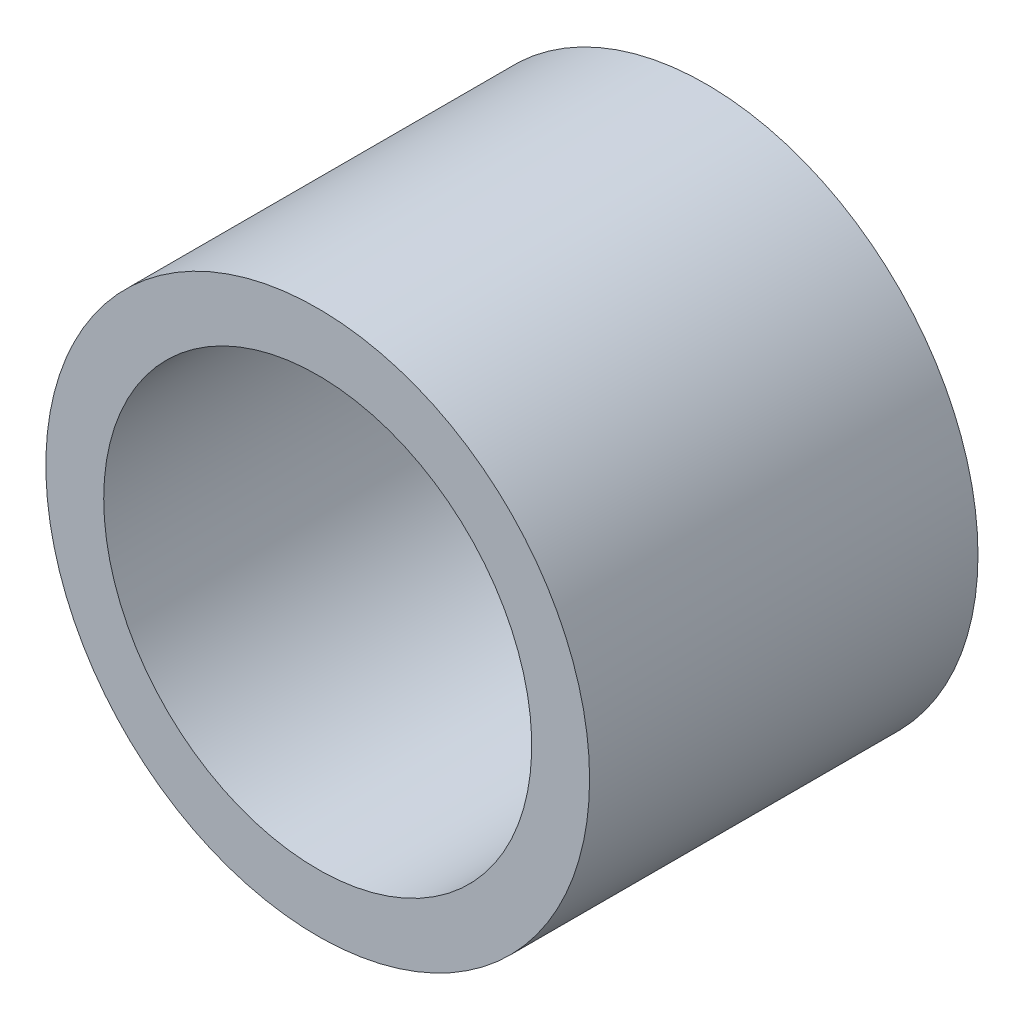
ISO-10303-21;
HEADER;
FILE_DESCRIPTION(('STEP AP214'),'2;1');
FILE_NAME('part.step','',(''),(''),'','','');
FILE_SCHEMA(('AUTOMOTIVE_DESIGN { 1 0 10303 214 1 1 1 1 }'));
ENDSEC;
DATA;
#1=APPLICATION_CONTEXT('core data for automotive mechanical design processes');
#2=APPLICATION_PROTOCOL_DEFINITION('international standard','automotive_design',2000,#1);
#3=PRODUCT_CONTEXT('',#1,'mechanical');
#4=PRODUCT('Part','Part','',(#3));
#5=PRODUCT_RELATED_PRODUCT_CATEGORY('part','',(#4));
#6=PRODUCT_DEFINITION_FORMATION('','',#4);
#7=PRODUCT_DEFINITION_CONTEXT('part definition',#1,'design');
#8=PRODUCT_DEFINITION('design','',#6,#7);
#9=PRODUCT_DEFINITION_SHAPE('','',#8);
#10=(LENGTH_UNIT() NAMED_UNIT(*) SI_UNIT(.MILLI.,.METRE.));
#11=(NAMED_UNIT(*) PLANE_ANGLE_UNIT() SI_UNIT($,.RADIAN.));
#12=(NAMED_UNIT(*) SI_UNIT($,.STERADIAN.) SOLID_ANGLE_UNIT());
#13=UNCERTAINTY_MEASURE_WITH_UNIT(LENGTH_MEASURE(1.E-05),#10,'distance_accuracy_value','');
#14=(GEOMETRIC_REPRESENTATION_CONTEXT(3) GLOBAL_UNCERTAINTY_ASSIGNED_CONTEXT((#13)) GLOBAL_UNIT_ASSIGNED_CONTEXT((#10,
#11,#12)) REPRESENTATION_CONTEXT('',''));
#15=CARTESIAN_POINT('',(0.,0.,0.));
#16=DIRECTION('',(0.,0.,1.));
#17=DIRECTION('',(1.,0.,0.));
#18=AXIS2_PLACEMENT_3D('',#15,#16,#17);
#19=CARTESIAN_POINT('',(0.,0.,20.));
#20=DIRECTION('',(0.,0.,-1.));
#21=DIRECTION('',(-1.,0.,0.));
#22=AXIS2_PLACEMENT_3D('',#19,#20,#21);
#23=CYLINDRICAL_SURFACE('',#22,14.);
#24=CARTESIAN_POINT('',(0.,0.,20.));
#25=DIRECTION('',(0.,0.,1.));
#26=DIRECTION('',(1.,0.,0.));
#27=AXIS2_PLACEMENT_3D('',#24,#25,#26);
#28=CIRCLE('',#27,14.);
#29=CARTESIAN_POINT('',(14.,0.,20.));
#30=VERTEX_POINT('',#29);
#31=EDGE_CURVE('E10',#30,#30,#28,.T.);
#32=ORIENTED_EDGE('',*,*,#31,.F.);
#33=EDGE_LOOP('',(#32));
#34=FACE_BOUND('',#33,.T.);
#35=CARTESIAN_POINT('',(0.,0.,0.));
#36=DIRECTION('',(0.,0.,1.));
#37=DIRECTION('',(1.,0.,0.));
#38=AXIS2_PLACEMENT_3D('',#35,#36,#37);
#39=CIRCLE('',#38,14.);
#40=CARTESIAN_POINT('',(14.,0.,0.));
#41=VERTEX_POINT('',#40);
#42=EDGE_CURVE('E42',#41,#41,#39,.T.);
#43=ORIENTED_EDGE('',*,*,#42,.T.);
#44=EDGE_LOOP('',(#43));
#45=FACE_BOUND('',#44,.T.);
#46=ADVANCED_FACE('F39',(#34,#45),#23,.T.);
#47=CARTESIAN_POINT('',(0.,0.,20.));
#48=DIRECTION('',(0.,0.,1.));
#49=DIRECTION('',(1.,0.,0.));
#50=AXIS2_PLACEMENT_3D('',#47,#48,#49);
#51=PLANE('',#50);
#52=CARTESIAN_POINT('',(0.,0.,20.));
#53=DIRECTION('',(0.,0.,-1.));
#54=DIRECTION('',(-1.,0.,0.));
#55=AXIS2_PLACEMENT_3D('',#52,#53,#54);
#56=CIRCLE('',#55,11.02);
#57=CARTESIAN_POINT('',(-11.02,0.,20.));
#58=VERTEX_POINT('',#57);
#59=EDGE_CURVE('E49',#58,#58,#56,.T.);
#60=ORIENTED_EDGE('',*,*,#59,.T.);
#61=EDGE_LOOP('',(#60));
#62=FACE_BOUND('',#61,.T.);
#63=ORIENTED_EDGE('',*,*,#31,.T.);
#64=EDGE_LOOP('',(#63));
#65=FACE_BOUND('',#64,.T.);
#66=ADVANCED_FACE('F57',(#62,#65),#51,.T.);
#67=CARTESIAN_POINT('',(0.,0.,0.));
#68=DIRECTION('',(0.,0.,1.));
#69=DIRECTION('',(1.,0.,0.));
#70=AXIS2_PLACEMENT_3D('',#67,#68,#69);
#71=PLANE('',#70);
#72=CARTESIAN_POINT('',(0.,0.,0.));
#73=DIRECTION('',(0.,0.,-1.));
#74=DIRECTION('',(-1.,0.,0.));
#75=AXIS2_PLACEMENT_3D('',#72,#73,#74);
#76=CIRCLE('',#75,11.02);
#77=CARTESIAN_POINT('',(-11.02,0.,0.));
#78=VERTEX_POINT('',#77);
#79=EDGE_CURVE('E51',#78,#78,#76,.T.);
#80=ORIENTED_EDGE('',*,*,#79,.F.);
#81=EDGE_LOOP('',(#80));
#82=FACE_BOUND('',#81,.T.);
#83=ORIENTED_EDGE('',*,*,#42,.F.);
#84=EDGE_LOOP('',(#83));
#85=FACE_BOUND('',#84,.T.);
#86=ADVANCED_FACE('F62',(#82,#85),#71,.F.);
#87=CARTESIAN_POINT('',(0.,0.,20.));
#88=DIRECTION('',(0.,0.,-1.));
#89=DIRECTION('',(-1.,0.,0.));
#90=AXIS2_PLACEMENT_3D('',#87,#88,#89);
#91=CYLINDRICAL_SURFACE('',#90,11.02);
#92=ORIENTED_EDGE('',*,*,#59,.F.);
#93=EDGE_LOOP('',(#92));
#94=FACE_BOUND('',#93,.T.);
#95=ORIENTED_EDGE('',*,*,#79,.T.);
#96=EDGE_LOOP('',(#95));
#97=FACE_BOUND('',#96,.T.);
#98=ADVANCED_FACE('F59',(#94,#97),#91,.F.);
#99=CLOSED_SHELL('',(#46,#66,#86,#98));
#100=MANIFOLD_SOLID_BREP('B2',#99);
#101=ADVANCED_BREP_SHAPE_REPRESENTATION('',(#18,#100),#14);
#102=SHAPE_DEFINITION_REPRESENTATION(#9,#101);
ENDSEC;
END-ISO-10303-21;
